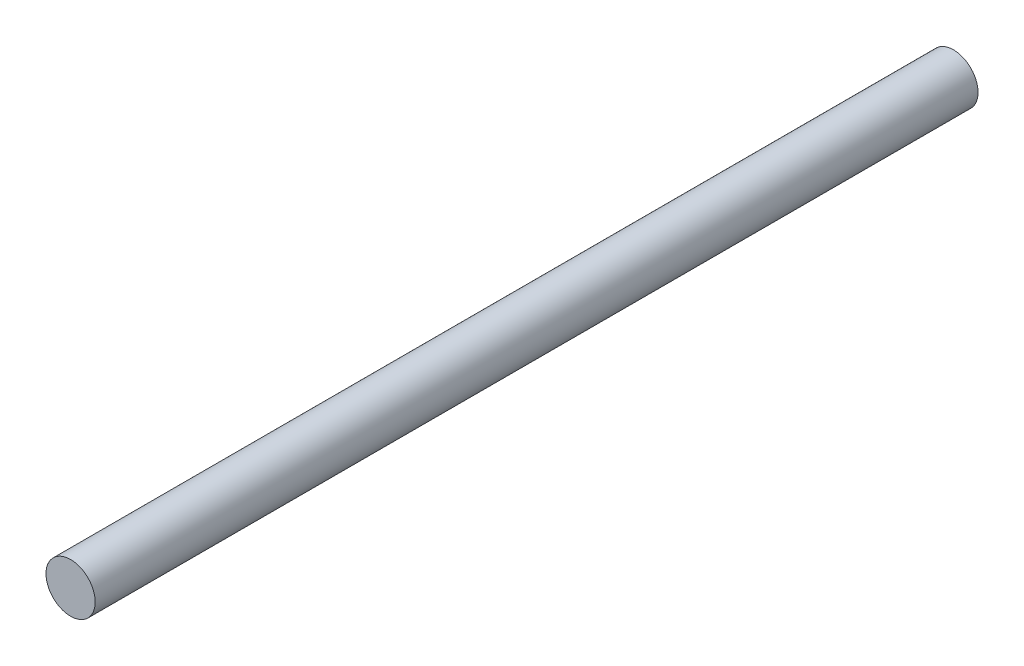
ISO-10303-21;
HEADER;
FILE_DESCRIPTION(('STEP AP214'),'2;1');
FILE_NAME('part.step','',(''),(''),'','','');
FILE_SCHEMA(('AUTOMOTIVE_DESIGN { 1 0 10303 214 1 1 1 1 }'));
ENDSEC;
DATA;
#1=APPLICATION_CONTEXT('core data for automotive mechanical design processes');
#2=APPLICATION_PROTOCOL_DEFINITION('international standard','automotive_design',2000,#1);
#3=PRODUCT_CONTEXT('',#1,'mechanical');
#4=PRODUCT('Part','Part','',(#3));
#5=PRODUCT_RELATED_PRODUCT_CATEGORY('part','',(#4));
#6=PRODUCT_DEFINITION_FORMATION('','',#4);
#7=PRODUCT_DEFINITION_CONTEXT('part definition',#1,'design');
#8=PRODUCT_DEFINITION('design','',#6,#7);
#9=PRODUCT_DEFINITION_SHAPE('','',#8);
#10=(LENGTH_UNIT() NAMED_UNIT(*) SI_UNIT(.MILLI.,.METRE.));
#11=(NAMED_UNIT(*) PLANE_ANGLE_UNIT() SI_UNIT($,.RADIAN.));
#12=(NAMED_UNIT(*) SI_UNIT($,.STERADIAN.) SOLID_ANGLE_UNIT());
#13=UNCERTAINTY_MEASURE_WITH_UNIT(LENGTH_MEASURE(1.E-05),#10,'distance_accuracy_value','');
#14=(GEOMETRIC_REPRESENTATION_CONTEXT(3) GLOBAL_UNCERTAINTY_ASSIGNED_CONTEXT((#13)) GLOBAL_UNIT_ASSIGNED_CONTEXT((#10,
#11,#12)) REPRESENTATION_CONTEXT('',''));
#15=CARTESIAN_POINT('',(0.,0.,0.));
#16=DIRECTION('',(0.,0.,1.));
#17=DIRECTION('',(1.,0.,0.));
#18=AXIS2_PLACEMENT_3D('',#15,#16,#17);
#19=CARTESIAN_POINT('',(0.,0.,180.));
#20=DIRECTION('',(0.,0.,-1.));
#21=DIRECTION('',(-1.,0.,0.));
#22=AXIS2_PLACEMENT_3D('',#19,#20,#21);
#23=CYLINDRICAL_SURFACE('',#22,3.89999999999999);
#24=CARTESIAN_POINT('',(0.,0.,180.));
#25=DIRECTION('',(0.,0.,-1.));
#26=DIRECTION('',(-1.,0.,0.));
#27=AXIS2_PLACEMENT_3D('',#24,#25,#26);
#28=CIRCLE('',#27,3.9);
#29=CARTESIAN_POINT('',(-3.9,0.,180.));
#30=VERTEX_POINT('',#29);
#31=EDGE_CURVE('E10',#30,#30,#28,.T.);
#32=ORIENTED_EDGE('',*,*,#31,.T.);
#33=EDGE_LOOP('',(#32));
#34=FACE_BOUND('',#33,.T.);
#35=CARTESIAN_POINT('',(0.,0.,40.));
#36=DIRECTION('',(0.,0.,-1.));
#37=DIRECTION('',(-1.,0.,0.));
#38=AXIS2_PLACEMENT_3D('',#35,#36,#37);
#39=CIRCLE('',#38,3.89999999999998);
#40=CARTESIAN_POINT('',(-3.89999999999997,0.,40.));
#41=VERTEX_POINT('',#40);
#42=EDGE_CURVE('E39',#41,#41,#39,.T.);
#43=ORIENTED_EDGE('',*,*,#42,.F.);
#44=EDGE_LOOP('',(#43));
#45=FACE_BOUND('',#44,.T.);
#46=ADVANCED_FACE('F33',(#34,#45),#23,.T.);
#47=CARTESIAN_POINT('',(3.9,0.,180.));
#48=DIRECTION('',(0.,0.,1.));
#49=DIRECTION('',(1.,0.,0.));
#50=AXIS2_PLACEMENT_3D('',#47,#48,#49);
#51=PLANE('',#50);
#52=ORIENTED_EDGE('',*,*,#31,.F.);
#53=EDGE_LOOP('',(#52));
#54=FACE_BOUND('',#53,.T.);
#55=ADVANCED_FACE('F48',(#54),#51,.T.);
#56=CARTESIAN_POINT('',(0.,0.,40.));
#57=DIRECTION('',(0.,0.,-1.));
#58=DIRECTION('',(-1.,0.,0.));
#59=AXIS2_PLACEMENT_3D('',#56,#57,#58);
#60=PLANE('',#59);
#61=ORIENTED_EDGE('',*,*,#42,.T.);
#62=EDGE_LOOP('',(#61));
#63=FACE_BOUND('',#62,.T.);
#64=ADVANCED_FACE('F45',(#63),#60,.T.);
#65=CLOSED_SHELL('',(#46,#55,#64));
#66=MANIFOLD_SOLID_BREP('B2',#65);
#67=ADVANCED_BREP_SHAPE_REPRESENTATION('',(#18,#66),#14);
#68=SHAPE_DEFINITION_REPRESENTATION(#9,#67);
ENDSEC;
END-ISO-10303-21;
